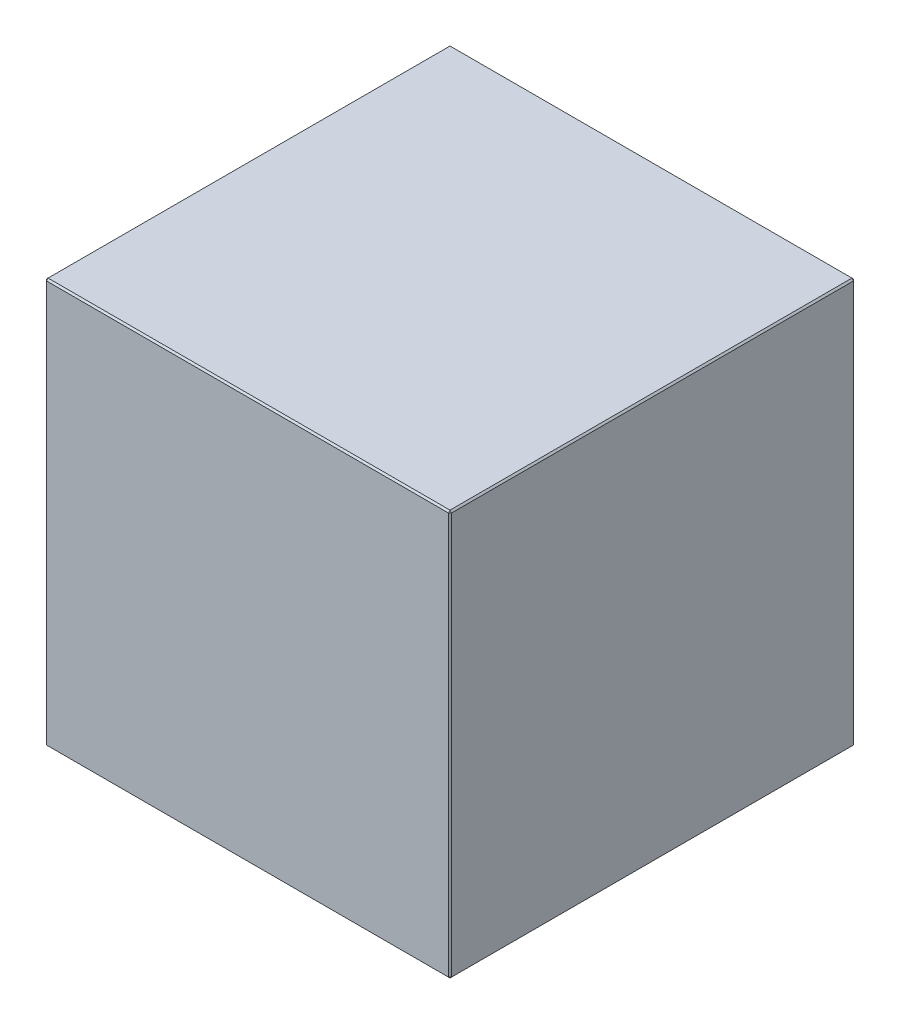
ISO-10303-21;
HEADER;
FILE_DESCRIPTION(('STEP AP214'),'2;1');
FILE_NAME('part.step','',(''),(''),'','','');
FILE_SCHEMA(('AUTOMOTIVE_DESIGN { 1 0 10303 214 1 1 1 1 }'));
ENDSEC;
DATA;
#1=APPLICATION_CONTEXT('core data for automotive mechanical design processes');
#2=APPLICATION_PROTOCOL_DEFINITION('international standard','automotive_design',2000,#1);
#3=PRODUCT_CONTEXT('',#1,'mechanical');
#4=PRODUCT('Part','Part','',(#3));
#5=PRODUCT_RELATED_PRODUCT_CATEGORY('part','',(#4));
#6=PRODUCT_DEFINITION_FORMATION('','',#4);
#7=PRODUCT_DEFINITION_CONTEXT('part definition',#1,'design');
#8=PRODUCT_DEFINITION('design','',#6,#7);
#9=PRODUCT_DEFINITION_SHAPE('','',#8);
#10=(LENGTH_UNIT() NAMED_UNIT(*) SI_UNIT(.MILLI.,.METRE.));
#11=(NAMED_UNIT(*) PLANE_ANGLE_UNIT() SI_UNIT($,.RADIAN.));
#12=(NAMED_UNIT(*) SI_UNIT($,.STERADIAN.) SOLID_ANGLE_UNIT());
#13=UNCERTAINTY_MEASURE_WITH_UNIT(LENGTH_MEASURE(1.E-05),#10,'distance_accuracy_value','');
#14=(GEOMETRIC_REPRESENTATION_CONTEXT(3) GLOBAL_UNCERTAINTY_ASSIGNED_CONTEXT((#13)) GLOBAL_UNIT_ASSIGNED_CONTEXT((#10,
#11,#12)) REPRESENTATION_CONTEXT('',''));
#15=CARTESIAN_POINT('',(0.,0.,0.));
#16=DIRECTION('',(0.,0.,1.));
#17=DIRECTION('',(1.,0.,0.));
#18=AXIS2_PLACEMENT_3D('',#15,#16,#17);
#19=CARTESIAN_POINT('',(125.,250.,125.));
#20=DIRECTION('',(-1.,0.,0.));
#21=DIRECTION('',(0.,0.,1.));
#22=AXIS2_PLACEMENT_3D('',#19,#20,#21);
#23=PLANE('',#22);
#24=DIRECTION('',(0.,1.,0.));
#25=VECTOR('',#24,1.);
#26=CARTESIAN_POINT('',(125.,250.,-124.));
#27=LINE('',#26,#25);
#28=CARTESIAN_POINT('',(125.,1.,-124.));
#29=VERTEX_POINT('',#28);
#30=CARTESIAN_POINT('',(125.,249.,-124.));
#31=VERTEX_POINT('',#30);
#32=EDGE_CURVE('E207',#29,#31,#27,.T.);
#33=ORIENTED_EDGE('',*,*,#32,.T.);
#34=DIRECTION('',(0.,0.,1.));
#35=VECTOR('',#34,1.);
#36=CARTESIAN_POINT('',(125.,249.,125.));
#37=LINE('',#36,#35);
#38=CARTESIAN_POINT('',(125.,249.,124.));
#39=VERTEX_POINT('',#38);
#40=EDGE_CURVE('E209',#31,#39,#37,.T.);
#41=ORIENTED_EDGE('',*,*,#40,.T.);
#42=DIRECTION('',(0.,-1.,0.));
#43=VECTOR('',#42,1.);
#44=CARTESIAN_POINT('',(125.,250.,124.));
#45=LINE('',#44,#43);
#46=CARTESIAN_POINT('',(125.,1.,124.));
#47=VERTEX_POINT('',#46);
#48=EDGE_CURVE('E203',#39,#47,#45,.T.);
#49=ORIENTED_EDGE('',*,*,#48,.T.);
#50=DIRECTION('',(0.,0.,-1.));
#51=VECTOR('',#50,1.);
#52=CARTESIAN_POINT('',(125.,1.,-125.));
#53=LINE('',#52,#51);
#54=EDGE_CURVE('E205',#47,#29,#53,.T.);
#55=ORIENTED_EDGE('',*,*,#54,.T.);
#56=EDGE_LOOP('',(#33,#41,#49,#55));
#57=FACE_BOUND('',#56,.T.);
#58=ADVANCED_FACE('F49',(#57),#23,.F.);
#59=CARTESIAN_POINT('',(-125.,250.,-125.));
#60=DIRECTION('',(0.,0.,1.));
#61=DIRECTION('',(1.,0.,0.));
#62=AXIS2_PLACEMENT_3D('',#59,#60,#61);
#63=PLANE('',#62);
#64=DIRECTION('',(-1.,0.,0.));
#65=VECTOR('',#64,1.);
#66=CARTESIAN_POINT('',(-125.,1.,-125.));
#67=LINE('',#66,#65);
#68=CARTESIAN_POINT('',(124.,1.,-125.));
#69=VERTEX_POINT('',#68);
#70=CARTESIAN_POINT('',(-124.,1.,-125.));
#71=VERTEX_POINT('',#70);
#72=EDGE_CURVE('E189',#69,#71,#67,.T.);
#73=ORIENTED_EDGE('',*,*,#72,.T.);
#74=DIRECTION('',(0.,1.,0.));
#75=VECTOR('',#74,1.);
#76=CARTESIAN_POINT('',(-124.,250.,-125.));
#77=LINE('',#76,#75);
#78=CARTESIAN_POINT('',(-124.,249.,-125.));
#79=VERTEX_POINT('',#78);
#80=EDGE_CURVE('E191',#71,#79,#77,.T.);
#81=ORIENTED_EDGE('',*,*,#80,.T.);
#82=DIRECTION('',(1.,0.,0.));
#83=VECTOR('',#82,1.);
#84=CARTESIAN_POINT('',(-125.,249.,-125.));
#85=LINE('',#84,#83);
#86=CARTESIAN_POINT('',(124.,249.,-125.));
#87=VERTEX_POINT('',#86);
#88=EDGE_CURVE('E187',#79,#87,#85,.T.);
#89=ORIENTED_EDGE('',*,*,#88,.T.);
#90=DIRECTION('',(0.,-1.,0.));
#91=VECTOR('',#90,1.);
#92=CARTESIAN_POINT('',(124.,250.,-125.));
#93=LINE('',#92,#91);
#94=EDGE_CURVE('E185',#87,#69,#93,.T.);
#95=ORIENTED_EDGE('',*,*,#94,.T.);
#96=EDGE_LOOP('',(#73,#81,#89,#95));
#97=FACE_BOUND('',#96,.T.);
#98=ADVANCED_FACE('F289',(#97),#63,.F.);
#99=CARTESIAN_POINT('',(-125.,250.,125.));
#100=DIRECTION('',(1.,0.,0.));
#101=DIRECTION('',(0.,0.,-1.));
#102=AXIS2_PLACEMENT_3D('',#99,#100,#101);
#103=PLANE('',#102);
#104=DIRECTION('',(0.,-1.,0.));
#105=VECTOR('',#104,1.);
#106=CARTESIAN_POINT('',(-125.,250.,-124.));
#107=LINE('',#106,#105);
#108=CARTESIAN_POINT('',(-125.,249.,-124.));
#109=VERTEX_POINT('',#108);
#110=CARTESIAN_POINT('',(-125.,1.,-124.));
#111=VERTEX_POINT('',#110);
#112=EDGE_CURVE('E172',#109,#111,#107,.T.);
#113=ORIENTED_EDGE('',*,*,#112,.T.);
#114=DIRECTION('',(0.,0.,1.));
#115=VECTOR('',#114,1.);
#116=CARTESIAN_POINT('',(-125.,1.,125.));
#117=LINE('',#116,#115);
#118=CARTESIAN_POINT('',(-125.,1.,124.));
#119=VERTEX_POINT('',#118);
#120=EDGE_CURVE('E144',#111,#119,#117,.T.);
#121=ORIENTED_EDGE('',*,*,#120,.T.);
#122=DIRECTION('',(0.,1.,0.));
#123=VECTOR('',#122,1.);
#124=CARTESIAN_POINT('',(-125.,250.,124.));
#125=LINE('',#124,#123);
#126=CARTESIAN_POINT('',(-125.,249.,124.));
#127=VERTEX_POINT('',#126);
#128=EDGE_CURVE('E162',#119,#127,#125,.T.);
#129=ORIENTED_EDGE('',*,*,#128,.T.);
#130=DIRECTION('',(0.,0.,-1.));
#131=VECTOR('',#130,1.);
#132=CARTESIAN_POINT('',(-125.,249.,125.));
#133=LINE('',#132,#131);
#134=EDGE_CURVE('E168',#127,#109,#133,.T.);
#135=ORIENTED_EDGE('',*,*,#134,.T.);
#136=EDGE_LOOP('',(#113,#121,#129,#135));
#137=FACE_BOUND('',#136,.T.);
#138=ADVANCED_FACE('F170',(#137),#103,.F.);
#139=CARTESIAN_POINT('',(-125.,250.,125.));
#140=DIRECTION('',(0.,0.,-1.));
#141=DIRECTION('',(-1.,0.,0.));
#142=AXIS2_PLACEMENT_3D('',#139,#140,#141);
#143=PLANE('',#142);
#144=DIRECTION('',(-1.,0.,0.));
#145=VECTOR('',#144,1.);
#146=CARTESIAN_POINT('',(-125.,249.,125.));
#147=LINE('',#146,#145);
#148=CARTESIAN_POINT('',(124.,249.,125.));
#149=VERTEX_POINT('',#148);
#150=CARTESIAN_POINT('',(-124.,249.,125.));
#151=VERTEX_POINT('',#150);
#152=EDGE_CURVE('E59',#149,#151,#147,.T.);
#153=ORIENTED_EDGE('',*,*,#152,.T.);
#154=DIRECTION('',(0.,-1.,0.));
#155=VECTOR('',#154,1.);
#156=CARTESIAN_POINT('',(-124.,250.,125.));
#157=LINE('',#156,#155);
#158=CARTESIAN_POINT('',(-124.,1.,125.));
#159=VERTEX_POINT('',#158);
#160=EDGE_CURVE('E11',#151,#159,#157,.T.);
#161=ORIENTED_EDGE('',*,*,#160,.T.);
#162=DIRECTION('',(1.,0.,0.));
#163=VECTOR('',#162,1.);
#164=CARTESIAN_POINT('',(125.,1.,125.));
#165=LINE('',#164,#163);
#166=CARTESIAN_POINT('',(124.,1.,125.));
#167=VERTEX_POINT('',#166);
#168=EDGE_CURVE('E212',#159,#167,#165,.T.);
#169=ORIENTED_EDGE('',*,*,#168,.T.);
#170=DIRECTION('',(0.,1.,0.));
#171=VECTOR('',#170,1.);
#172=CARTESIAN_POINT('',(124.,250.,125.));
#173=LINE('',#172,#171);
#174=EDGE_CURVE('E70',#167,#149,#173,.T.);
#175=ORIENTED_EDGE('',*,*,#174,.T.);
#176=EDGE_LOOP('',(#153,#161,#169,#175));
#177=FACE_BOUND('',#176,.T.);
#178=ADVANCED_FACE('F450',(#177),#143,.F.);
#179=CARTESIAN_POINT('',(0.,250.,0.));
#180=DIRECTION('',(0.,-1.,0.));
#181=DIRECTION('',(0.,0.,-1.));
#182=AXIS2_PLACEMENT_3D('',#179,#180,#181);
#183=PLANE('',#182);
#184=DIRECTION('',(-1.,0.,0.));
#185=VECTOR('',#184,1.);
#186=CARTESIAN_POINT('',(0.,250.,-124.));
#187=LINE('',#186,#185);
#188=CARTESIAN_POINT('',(124.,250.,-124.));
#189=VERTEX_POINT('',#188);
#190=CARTESIAN_POINT('',(-124.,250.,-124.));
#191=VERTEX_POINT('',#190);
#192=EDGE_CURVE('E198',#189,#191,#187,.T.);
#193=ORIENTED_EDGE('',*,*,#192,.T.);
#194=DIRECTION('',(0.,0.,1.));
#195=VECTOR('',#194,1.);
#196=CARTESIAN_POINT('',(-124.,250.,0.));
#197=LINE('',#196,#195);
#198=CARTESIAN_POINT('',(-124.,250.,124.));
#199=VERTEX_POINT('',#198);
#200=EDGE_CURVE('E200',#191,#199,#197,.T.);
#201=ORIENTED_EDGE('',*,*,#200,.T.);
#202=DIRECTION('',(1.,0.,0.));
#203=VECTOR('',#202,1.);
#204=CARTESIAN_POINT('',(0.,250.,124.));
#205=LINE('',#204,#203);
#206=CARTESIAN_POINT('',(124.,250.,124.));
#207=VERTEX_POINT('',#206);
#208=EDGE_CURVE('E194',#199,#207,#205,.T.);
#209=ORIENTED_EDGE('',*,*,#208,.T.);
#210=DIRECTION('',(0.,0.,-1.));
#211=VECTOR('',#210,1.);
#212=CARTESIAN_POINT('',(124.,250.,0.));
#213=LINE('',#212,#211);
#214=EDGE_CURVE('E196',#207,#189,#213,.T.);
#215=ORIENTED_EDGE('',*,*,#214,.T.);
#216=EDGE_LOOP('',(#193,#201,#209,#215));
#217=FACE_BOUND('',#216,.T.);
#218=ADVANCED_FACE('F298',(#217),#183,.F.);
#219=CARTESIAN_POINT('',(0.,0.,0.));
#220=DIRECTION('',(0.,-1.,0.));
#221=DIRECTION('',(0.,0.,-1.));
#222=AXIS2_PLACEMENT_3D('',#219,#220,#221);
#223=PLANE('',#222);
#224=DIRECTION('',(-1.,0.,0.));
#225=VECTOR('',#224,1.);
#226=CARTESIAN_POINT('',(-125.,0.,124.));
#227=LINE('',#226,#225);
#228=CARTESIAN_POINT('',(124.,0.,124.));
#229=VERTEX_POINT('',#228);
#230=CARTESIAN_POINT('',(-124.,0.,124.));
#231=VERTEX_POINT('',#230);
#232=EDGE_CURVE('E174',#229,#231,#227,.T.);
#233=ORIENTED_EDGE('',*,*,#232,.T.);
#234=DIRECTION('',(0.,0.,-1.));
#235=VECTOR('',#234,1.);
#236=CARTESIAN_POINT('',(-124.,0.,-125.));
#237=LINE('',#236,#235);
#238=CARTESIAN_POINT('',(-124.,0.,-124.));
#239=VERTEX_POINT('',#238);
#240=EDGE_CURVE('E146',#231,#239,#237,.T.);
#241=ORIENTED_EDGE('',*,*,#240,.T.);
#242=DIRECTION('',(1.,0.,0.));
#243=VECTOR('',#242,1.);
#244=CARTESIAN_POINT('',(125.,0.,-124.));
#245=LINE('',#244,#243);
#246=CARTESIAN_POINT('',(124.,0.,-124.));
#247=VERTEX_POINT('',#246);
#248=EDGE_CURVE('E182',#239,#247,#245,.T.);
#249=ORIENTED_EDGE('',*,*,#248,.T.);
#250=DIRECTION('',(0.,0.,1.));
#251=VECTOR('',#250,1.);
#252=CARTESIAN_POINT('',(124.,0.,125.));
#253=LINE('',#252,#251);
#254=EDGE_CURVE('E176',#247,#229,#253,.T.);
#255=ORIENTED_EDGE('',*,*,#254,.T.);
#256=EDGE_LOOP('',(#233,#241,#249,#255));
#257=FACE_BOUND('',#256,.T.);
#258=ADVANCED_FACE('F324',(#257),#223,.T.);
#259=CARTESIAN_POINT('',(124.,250.,0.));
#260=DIRECTION('',(-0.707106781186547,-0.707106781186547,0.));
#261=DIRECTION('',(0.,0.,-1.));
#262=AXIS2_PLACEMENT_3D('',#259,#260,#261);
#263=PLANE('',#262);
#264=DIRECTION('',(-0.707106781186547,0.707106781186547,0.));
#265=VECTOR('',#264,1.);
#266=CARTESIAN_POINT('',(124.5,249.5,-124.));
#267=LINE('',#266,#265);
#268=EDGE_CURVE('E54',#189,#31,#267,.F.);
#269=ORIENTED_EDGE('',*,*,#268,.F.);
#270=ORIENTED_EDGE('',*,*,#214,.F.);
#271=DIRECTION('',(0.707106781186547,-0.707106781186547,0.));
#272=VECTOR('',#271,1.);
#273=CARTESIAN_POINT('',(125.,249.,124.));
#274=LINE('',#273,#272);
#275=EDGE_CURVE('E265',#39,#207,#274,.F.);
#276=ORIENTED_EDGE('',*,*,#275,.F.);
#277=ORIENTED_EDGE('',*,*,#40,.F.);
#278=EDGE_LOOP('',(#269,#270,#276,#277));
#279=FACE_BOUND('',#278,.T.);
#280=ADVANCED_FACE('F52',(#279),#263,.F.);
#281=CARTESIAN_POINT('',(124.,249.,-125.));
#282=DIRECTION('',(0.577350269189626,0.577350269189626,-0.577350269189626));
#283=DIRECTION('',(-0.707106781186547,0.,-0.707106781186547));
#284=AXIS2_PLACEMENT_3D('',#281,#282,#283);
#285=PLANE('',#284);
#286=DIRECTION('',(0.,-0.707106781186547,-0.707106781186547));
#287=VECTOR('',#286,1.);
#288=CARTESIAN_POINT('',(124.,249.,-125.));
#289=LINE('',#288,#287);
#290=EDGE_CURVE('E260',#189,#87,#289,.T.);
#291=ORIENTED_EDGE('',*,*,#290,.F.);
#292=ORIENTED_EDGE('',*,*,#268,.T.);
#293=DIRECTION('',(0.707106781186547,0.,0.707106781186547));
#294=VECTOR('',#293,1.);
#295=CARTESIAN_POINT('',(124.,249.,-125.));
#296=LINE('',#295,#294);
#297=EDGE_CURVE('E263',#87,#31,#296,.T.);
#298=ORIENTED_EDGE('',*,*,#297,.F.);
#299=EDGE_LOOP('',(#291,#292,#298));
#300=FACE_BOUND('',#299,.T.);
#301=ADVANCED_FACE('F276',(#300),#285,.T.);
#302=CARTESIAN_POINT('',(125.,249.,124.));
#303=DIRECTION('',(0.577350269189626,0.577350269189626,0.577350269189626));
#304=DIRECTION('',(0.707106781186547,0.,-0.707106781186547));
#305=AXIS2_PLACEMENT_3D('',#302,#303,#304);
#306=PLANE('',#305);
#307=DIRECTION('',(-0.707106781186547,0.,0.707106781186547));
#308=VECTOR('',#307,1.);
#309=CARTESIAN_POINT('',(125.,249.,124.));
#310=LINE('',#309,#308);
#311=EDGE_CURVE('E255',#39,#149,#310,.T.);
#312=ORIENTED_EDGE('',*,*,#311,.F.);
#313=ORIENTED_EDGE('',*,*,#275,.T.);
#314=DIRECTION('',(0.,0.707106781186547,-0.707106781186547));
#315=VECTOR('',#314,1.);
#316=CARTESIAN_POINT('',(124.,249.5,124.5));
#317=LINE('',#316,#315);
#318=EDGE_CURVE('E257',#149,#207,#317,.T.);
#319=ORIENTED_EDGE('',*,*,#318,.F.);
#320=EDGE_LOOP('',(#312,#313,#319));
#321=FACE_BOUND('',#320,.T.);
#322=ADVANCED_FACE('F432',(#321),#306,.T.);
#323=CARTESIAN_POINT('',(124.,250.,-125.));
#324=DIRECTION('',(-0.707106781186547,0.,0.707106781186547));
#325=DIRECTION('',(0.,-1.,0.));
#326=AXIS2_PLACEMENT_3D('',#323,#324,#325);
#327=PLANE('',#326);
#328=ORIENTED_EDGE('',*,*,#297,.T.);
#329=ORIENTED_EDGE('',*,*,#32,.F.);
#330=DIRECTION('',(-0.707106781186547,0.,-0.707106781186547));
#331=VECTOR('',#330,1.);
#332=CARTESIAN_POINT('',(124.5,1.,-124.5));
#333=LINE('',#332,#331);
#334=EDGE_CURVE('E249',#69,#29,#333,.F.);
#335=ORIENTED_EDGE('',*,*,#334,.F.);
#336=ORIENTED_EDGE('',*,*,#94,.F.);
#337=EDGE_LOOP('',(#328,#329,#335,#336));
#338=FACE_BOUND('',#337,.T.);
#339=ADVANCED_FACE('F284',(#338),#327,.F.);
#340=CARTESIAN_POINT('',(0.,250.,-124.));
#341=DIRECTION('',(0.,-0.707106781186547,0.707106781186547));
#342=DIRECTION('',(-1.,0.,0.));
#343=AXIS2_PLACEMENT_3D('',#340,#341,#342);
#344=PLANE('',#343);
#345=ORIENTED_EDGE('',*,*,#290,.T.);
#346=ORIENTED_EDGE('',*,*,#88,.F.);
#347=DIRECTION('',(0.,0.707106781186547,0.707106781186547));
#348=VECTOR('',#347,1.);
#349=CARTESIAN_POINT('',(-124.,249.,-125.));
#350=LINE('',#349,#348);
#351=EDGE_CURVE('E246',#191,#79,#350,.F.);
#352=ORIENTED_EDGE('',*,*,#351,.F.);
#353=ORIENTED_EDGE('',*,*,#192,.F.);
#354=EDGE_LOOP('',(#345,#346,#352,#353));
#355=FACE_BOUND('',#354,.T.);
#356=ADVANCED_FACE('F295',(#355),#344,.F.);
#357=CARTESIAN_POINT('',(-124.,250.,0.));
#358=DIRECTION('',(0.707106781186547,-0.707106781186547,0.));
#359=DIRECTION('',(0.,0.,1.));
#360=AXIS2_PLACEMENT_3D('',#357,#358,#359);
#361=PLANE('',#360);
#362=DIRECTION('',(0.707106781186547,0.707106781186547,0.));
#363=VECTOR('',#362,1.);
#364=CARTESIAN_POINT('',(-124.,250.,124.));
#365=LINE('',#364,#363);
#366=EDGE_CURVE('E240',#199,#127,#365,.F.);
#367=ORIENTED_EDGE('',*,*,#366,.F.);
#368=ORIENTED_EDGE('',*,*,#200,.F.);
#369=DIRECTION('',(-0.707106781186547,-0.707106781186547,0.));
#370=VECTOR('',#369,1.);
#371=CARTESIAN_POINT('',(-124.5,249.5,-124.));
#372=LINE('',#371,#370);
#373=EDGE_CURVE('E243',#109,#191,#372,.F.);
#374=ORIENTED_EDGE('',*,*,#373,.F.);
#375=ORIENTED_EDGE('',*,*,#134,.F.);
#376=EDGE_LOOP('',(#367,#368,#374,#375));
#377=FACE_BOUND('',#376,.T.);
#378=ADVANCED_FACE('F302',(#377),#361,.F.);
#379=CARTESIAN_POINT('',(0.,250.,124.));
#380=DIRECTION('',(0.,-0.707106781186547,-0.707106781186547));
#381=DIRECTION('',(1.,0.,0.));
#382=AXIS2_PLACEMENT_3D('',#379,#380,#381);
#383=PLANE('',#382);
#384=ORIENTED_EDGE('',*,*,#318,.T.);
#385=ORIENTED_EDGE('',*,*,#208,.F.);
#386=DIRECTION('',(0.,-0.707106781186547,0.707106781186547));
#387=VECTOR('',#386,1.);
#388=CARTESIAN_POINT('',(-124.,250.,124.));
#389=LINE('',#388,#387);
#390=EDGE_CURVE('E238',#151,#199,#389,.F.);
#391=ORIENTED_EDGE('',*,*,#390,.F.);
#392=ORIENTED_EDGE('',*,*,#152,.F.);
#393=EDGE_LOOP('',(#384,#385,#391,#392));
#394=FACE_BOUND('',#393,.T.);
#395=ADVANCED_FACE('F307',(#394),#383,.F.);
#396=CARTESIAN_POINT('',(125.,250.,124.));
#397=DIRECTION('',(-0.707106781186547,0.,-0.707106781186547));
#398=DIRECTION('',(0.,-1.,0.));
#399=AXIS2_PLACEMENT_3D('',#396,#397,#398);
#400=PLANE('',#399);
#401=ORIENTED_EDGE('',*,*,#311,.T.);
#402=ORIENTED_EDGE('',*,*,#174,.F.);
#403=DIRECTION('',(0.707106781186547,0.,-0.707106781186547));
#404=VECTOR('',#403,1.);
#405=CARTESIAN_POINT('',(124.5,1.,124.5));
#406=LINE('',#405,#404);
#407=EDGE_CURVE('E235',#47,#167,#406,.F.);
#408=ORIENTED_EDGE('',*,*,#407,.F.);
#409=ORIENTED_EDGE('',*,*,#48,.F.);
#410=EDGE_LOOP('',(#401,#402,#408,#409));
#411=FACE_BOUND('',#410,.T.);
#412=ADVANCED_FACE('F317',(#411),#400,.F.);
#413=CARTESIAN_POINT('',(125.,1.,125.));
#414=DIRECTION('',(0.707106781186547,-0.707106781186547,0.));
#415=DIRECTION('',(0.,0.,1.));
#416=AXIS2_PLACEMENT_3D('',#413,#414,#415);
#417=PLANE('',#416);
#418=DIRECTION('',(-0.707106781186547,-0.707106781186547,0.));
#419=VECTOR('',#418,1.);
#420=CARTESIAN_POINT('',(124.,0.,-124.));
#421=LINE('',#420,#419);
#422=EDGE_CURVE('E252',#29,#247,#421,.T.);
#423=ORIENTED_EDGE('',*,*,#422,.F.);
#424=ORIENTED_EDGE('',*,*,#54,.F.);
#425=DIRECTION('',(0.707106781186547,0.707106781186547,0.));
#426=VECTOR('',#425,1.);
#427=CARTESIAN_POINT('',(124.,0.,124.));
#428=LINE('',#427,#426);
#429=EDGE_CURVE('E232',#229,#47,#428,.T.);
#430=ORIENTED_EDGE('',*,*,#429,.F.);
#431=ORIENTED_EDGE('',*,*,#254,.F.);
#432=EDGE_LOOP('',(#423,#424,#430,#431));
#433=FACE_BOUND('',#432,.T.);
#434=ADVANCED_FACE('F313',(#433),#417,.T.);
#435=CARTESIAN_POINT('',(124.,0.,-124.));
#436=DIRECTION('',(0.577350269189626,-0.577350269189626,-0.577350269189626));
#437=DIRECTION('',(-0.707106781186547,0.,-0.707106781186547));
#438=AXIS2_PLACEMENT_3D('',#435,#436,#437);
#439=PLANE('',#438);
#440=ORIENTED_EDGE('',*,*,#334,.T.);
#441=ORIENTED_EDGE('',*,*,#422,.T.);
#442=DIRECTION('',(0.,0.707106781186547,-0.707106781186547));
#443=VECTOR('',#442,1.);
#444=CARTESIAN_POINT('',(124.,0.,-124.));
#445=LINE('',#444,#443);
#446=EDGE_CURVE('E229',#69,#247,#445,.F.);
#447=ORIENTED_EDGE('',*,*,#446,.F.);
#448=EDGE_LOOP('',(#440,#441,#447));
#449=FACE_BOUND('',#448,.T.);
#450=ADVANCED_FACE('F327',(#449),#439,.T.);
#451=CARTESIAN_POINT('',(-124.,249.,-125.));
#452=DIRECTION('',(-0.577350269189626,0.577350269189626,-0.577350269189626));
#453=DIRECTION('',(-0.707106781186547,0.,0.707106781186547));
#454=AXIS2_PLACEMENT_3D('',#451,#452,#453);
#455=PLANE('',#454);
#456=ORIENTED_EDGE('',*,*,#373,.T.);
#457=ORIENTED_EDGE('',*,*,#351,.T.);
#458=DIRECTION('',(0.707106781186547,0.,-0.707106781186547));
#459=VECTOR('',#458,1.);
#460=CARTESIAN_POINT('',(-124.,249.,-125.));
#461=LINE('',#460,#459);
#462=EDGE_CURVE('E227',#109,#79,#461,.T.);
#463=ORIENTED_EDGE('',*,*,#462,.F.);
#464=EDGE_LOOP('',(#456,#457,#463));
#465=FACE_BOUND('',#464,.T.);
#466=ADVANCED_FACE('F337',(#465),#455,.T.);
#467=CARTESIAN_POINT('',(-124.,250.,124.));
#468=DIRECTION('',(-0.577350269189626,0.577350269189626,0.577350269189626));
#469=DIRECTION('',(0.707106781186547,0.,0.707106781186547));
#470=AXIS2_PLACEMENT_3D('',#467,#468,#469);
#471=PLANE('',#470);
#472=ORIENTED_EDGE('',*,*,#390,.T.);
#473=ORIENTED_EDGE('',*,*,#366,.T.);
#474=DIRECTION('',(-0.707106781186547,0.,-0.707106781186547));
#475=VECTOR('',#474,1.);
#476=CARTESIAN_POINT('',(-124.5,249.,124.5));
#477=LINE('',#476,#475);
#478=EDGE_CURVE('E165',#151,#127,#477,.T.);
#479=ORIENTED_EDGE('',*,*,#478,.F.);
#480=EDGE_LOOP('',(#472,#473,#479));
#481=FACE_BOUND('',#480,.T.);
#482=ADVANCED_FACE('F339',(#481),#471,.T.);
#483=CARTESIAN_POINT('',(124.,0.,124.));
#484=DIRECTION('',(0.577350269189626,-0.577350269189626,0.577350269189626));
#485=DIRECTION('',(0.707106781186547,0.,-0.707106781186547));
#486=AXIS2_PLACEMENT_3D('',#483,#484,#485);
#487=PLANE('',#486);
#488=ORIENTED_EDGE('',*,*,#429,.T.);
#489=ORIENTED_EDGE('',*,*,#407,.T.);
#490=DIRECTION('',(0.,-0.707106781186547,-0.707106781186547));
#491=VECTOR('',#490,1.);
#492=CARTESIAN_POINT('',(124.,0.,124.));
#493=LINE('',#492,#491);
#494=EDGE_CURVE('E223',#229,#167,#493,.F.);
#495=ORIENTED_EDGE('',*,*,#494,.F.);
#496=EDGE_LOOP('',(#488,#489,#495));
#497=FACE_BOUND('',#496,.T.);
#498=ADVANCED_FACE('F319',(#497),#487,.T.);
#499=CARTESIAN_POINT('',(-125.,1.,-125.));
#500=DIRECTION('',(0.,-0.707106781186547,-0.707106781186547));
#501=DIRECTION('',(1.,0.,0.));
#502=AXIS2_PLACEMENT_3D('',#499,#500,#501);
#503=PLANE('',#502);
#504=ORIENTED_EDGE('',*,*,#446,.T.);
#505=ORIENTED_EDGE('',*,*,#248,.F.);
#506=DIRECTION('',(0.,-0.707106781186547,0.707106781186547));
#507=VECTOR('',#506,1.);
#508=CARTESIAN_POINT('',(-124.,0.,-124.));
#509=LINE('',#508,#507);
#510=EDGE_CURVE('E220',#71,#239,#509,.T.);
#511=ORIENTED_EDGE('',*,*,#510,.F.);
#512=ORIENTED_EDGE('',*,*,#72,.F.);
#513=EDGE_LOOP('',(#504,#505,#511,#512));
#514=FACE_BOUND('',#513,.T.);
#515=ADVANCED_FACE('F329',(#514),#503,.T.);
#516=CARTESIAN_POINT('',(-125.,250.,-124.));
#517=DIRECTION('',(0.707106781186547,0.,0.707106781186547));
#518=DIRECTION('',(0.,-1.,0.));
#519=AXIS2_PLACEMENT_3D('',#516,#517,#518);
#520=PLANE('',#519);
#521=ORIENTED_EDGE('',*,*,#462,.T.);
#522=ORIENTED_EDGE('',*,*,#80,.F.);
#523=DIRECTION('',(-0.707106781186547,0.,0.707106781186547));
#524=VECTOR('',#523,1.);
#525=CARTESIAN_POINT('',(-124.5,1.,-124.5));
#526=LINE('',#525,#524);
#527=EDGE_CURVE('E159',#111,#71,#526,.F.);
#528=ORIENTED_EDGE('',*,*,#527,.F.);
#529=ORIENTED_EDGE('',*,*,#112,.F.);
#530=EDGE_LOOP('',(#521,#522,#528,#529));
#531=FACE_BOUND('',#530,.T.);
#532=ADVANCED_FACE('F335',(#531),#520,.F.);
#533=CARTESIAN_POINT('',(-124.,250.,125.));
#534=DIRECTION('',(0.707106781186547,0.,-0.707106781186547));
#535=DIRECTION('',(0.,-1.,0.));
#536=AXIS2_PLACEMENT_3D('',#533,#534,#535);
#537=PLANE('',#536);
#538=ORIENTED_EDGE('',*,*,#478,.T.);
#539=ORIENTED_EDGE('',*,*,#128,.F.);
#540=DIRECTION('',(0.707106781186547,0.,0.707106781186547));
#541=VECTOR('',#540,1.);
#542=CARTESIAN_POINT('',(-125.,1.,124.));
#543=LINE('',#542,#541);
#544=EDGE_CURVE('E151',#159,#119,#543,.F.);
#545=ORIENTED_EDGE('',*,*,#544,.F.);
#546=ORIENTED_EDGE('',*,*,#160,.F.);
#547=EDGE_LOOP('',(#538,#539,#545,#546));
#548=FACE_BOUND('',#547,.T.);
#549=ADVANCED_FACE('F163',(#548),#537,.F.);
#550=CARTESIAN_POINT('',(-125.,1.,125.));
#551=DIRECTION('',(0.,-0.707106781186547,0.707106781186547));
#552=DIRECTION('',(-1.,0.,0.));
#553=AXIS2_PLACEMENT_3D('',#550,#551,#552);
#554=PLANE('',#553);
#555=ORIENTED_EDGE('',*,*,#494,.T.);
#556=ORIENTED_EDGE('',*,*,#168,.F.);
#557=DIRECTION('',(0.,0.707106781186547,0.707106781186547));
#558=VECTOR('',#557,1.);
#559=CARTESIAN_POINT('',(-124.,0.5,124.5));
#560=LINE('',#559,#558);
#561=EDGE_CURVE('E155',#231,#159,#560,.T.);
#562=ORIENTED_EDGE('',*,*,#561,.F.);
#563=ORIENTED_EDGE('',*,*,#232,.F.);
#564=EDGE_LOOP('',(#555,#556,#562,#563));
#565=FACE_BOUND('',#564,.T.);
#566=ADVANCED_FACE('F322',(#565),#554,.T.);
#567=CARTESIAN_POINT('',(-124.,0.,-124.));
#568=DIRECTION('',(-0.577350269189626,-0.577350269189626,-0.577350269189626));
#569=DIRECTION('',(-0.707106781186547,0.,0.707106781186547));
#570=AXIS2_PLACEMENT_3D('',#567,#568,#569);
#571=PLANE('',#570);
#572=ORIENTED_EDGE('',*,*,#527,.T.);
#573=ORIENTED_EDGE('',*,*,#510,.T.);
#574=DIRECTION('',(-0.707106781186547,0.707106781186547,0.));
#575=VECTOR('',#574,1.);
#576=CARTESIAN_POINT('',(-124.,0.,-124.));
#577=LINE('',#576,#575);
#578=EDGE_CURVE('E148',#111,#239,#577,.F.);
#579=ORIENTED_EDGE('',*,*,#578,.F.);
#580=EDGE_LOOP('',(#572,#573,#579));
#581=FACE_BOUND('',#580,.T.);
#582=ADVANCED_FACE('F333',(#581),#571,.T.);
#583=CARTESIAN_POINT('',(-125.,1.,124.));
#584=DIRECTION('',(-0.577350269189626,-0.577350269189626,0.577350269189626));
#585=DIRECTION('',(0.707106781186547,0.,0.707106781186547));
#586=AXIS2_PLACEMENT_3D('',#583,#584,#585);
#587=PLANE('',#586);
#588=ORIENTED_EDGE('',*,*,#561,.T.);
#589=ORIENTED_EDGE('',*,*,#544,.T.);
#590=DIRECTION('',(0.707106781186547,-0.707106781186547,0.));
#591=VECTOR('',#590,1.);
#592=CARTESIAN_POINT('',(-125.,1.,124.));
#593=LINE('',#592,#591);
#594=EDGE_CURVE('E140',#231,#119,#593,.F.);
#595=ORIENTED_EDGE('',*,*,#594,.F.);
#596=EDGE_LOOP('',(#588,#589,#595));
#597=FACE_BOUND('',#596,.T.);
#598=ADVANCED_FACE('F153',(#597),#587,.T.);
#599=CARTESIAN_POINT('',(-125.,1.,125.));
#600=DIRECTION('',(-0.707106781186547,-0.707106781186547,0.));
#601=DIRECTION('',(0.,0.,-1.));
#602=AXIS2_PLACEMENT_3D('',#599,#600,#601);
#603=PLANE('',#602);
#604=ORIENTED_EDGE('',*,*,#578,.T.);
#605=ORIENTED_EDGE('',*,*,#240,.F.);
#606=ORIENTED_EDGE('',*,*,#594,.T.);
#607=ORIENTED_EDGE('',*,*,#120,.F.);
#608=EDGE_LOOP('',(#604,#605,#606,#607));
#609=FACE_BOUND('',#608,.T.);
#610=ADVANCED_FACE('F142',(#609),#603,.T.);
#611=CLOSED_SHELL('',(#58,#98,#138,#178,#218,#258,#280,#301,#322,#339,#356,#378,#395,#412,#434,
#450,#466,#482,#498,#515,#532,#549,#566,#582,#598,#610));
#612=MANIFOLD_SOLID_BREP('B2',#611);
#613=ADVANCED_BREP_SHAPE_REPRESENTATION('',(#18,#612),#14);
#614=SHAPE_DEFINITION_REPRESENTATION(#9,#613);
ENDSEC;
END-ISO-10303-21;
